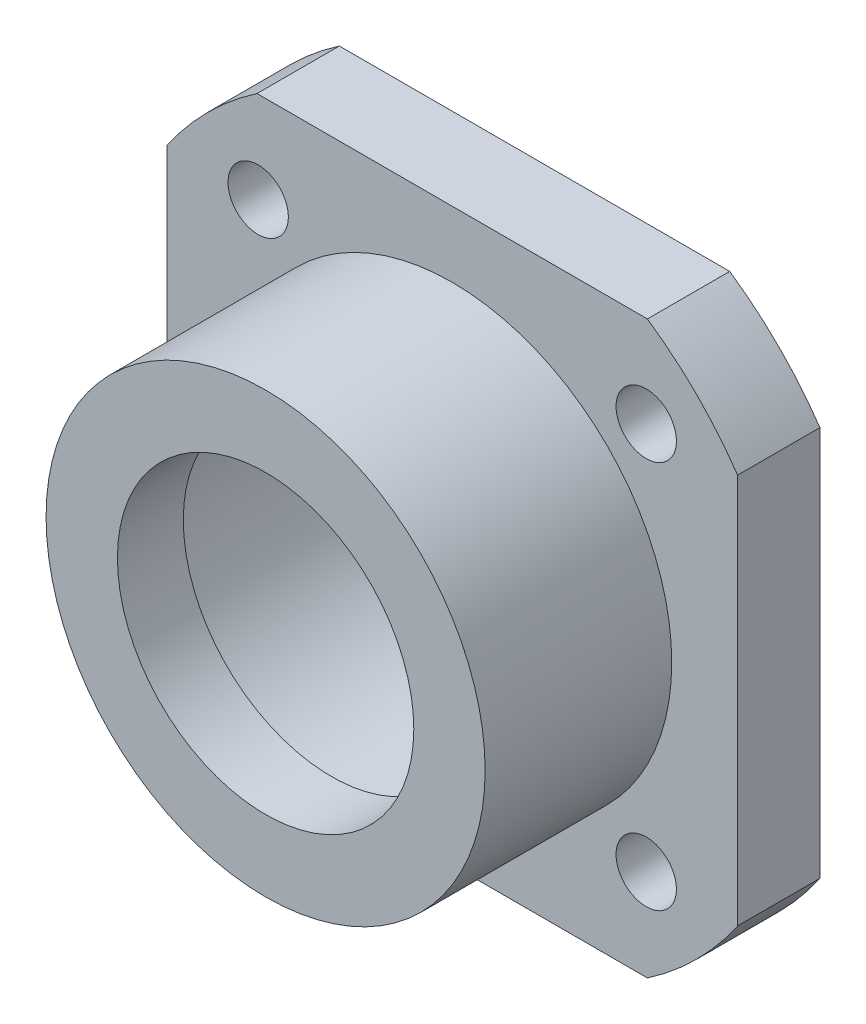
ISO-10303-21;
HEADER;
FILE_DESCRIPTION(('STEP AP214'),'2;1');
FILE_NAME('part.step','',(''),(''),'','','');
FILE_SCHEMA(('AUTOMOTIVE_DESIGN { 1 0 10303 214 1 1 1 1 }'));
ENDSEC;
DATA;
#1=APPLICATION_CONTEXT('core data for automotive mechanical design processes');
#2=APPLICATION_PROTOCOL_DEFINITION('international standard','automotive_design',2000,#1);
#3=PRODUCT_CONTEXT('',#1,'mechanical');
#4=PRODUCT('Part','Part','',(#3));
#5=PRODUCT_RELATED_PRODUCT_CATEGORY('part','',(#4));
#6=PRODUCT_DEFINITION_FORMATION('','',#4);
#7=PRODUCT_DEFINITION_CONTEXT('part definition',#1,'design');
#8=PRODUCT_DEFINITION('design','',#6,#7);
#9=PRODUCT_DEFINITION_SHAPE('','',#8);
#10=(LENGTH_UNIT() NAMED_UNIT(*) SI_UNIT(.MILLI.,.METRE.));
#11=(NAMED_UNIT(*) PLANE_ANGLE_UNIT() SI_UNIT($,.RADIAN.));
#12=(NAMED_UNIT(*) SI_UNIT($,.STERADIAN.) SOLID_ANGLE_UNIT());
#13=UNCERTAINTY_MEASURE_WITH_UNIT(LENGTH_MEASURE(1.E-05),#10,'distance_accuracy_value','');
#14=(GEOMETRIC_REPRESENTATION_CONTEXT(3) GLOBAL_UNCERTAINTY_ASSIGNED_CONTEXT((#13)) GLOBAL_UNIT_ASSIGNED_CONTEXT((#10,
#11,#12)) REPRESENTATION_CONTEXT('',''));
#15=CARTESIAN_POINT('',(0.,0.,0.));
#16=DIRECTION('',(0.,0.,1.));
#17=DIRECTION('',(1.,0.,0.));
#18=AXIS2_PLACEMENT_3D('',#15,#16,#17);
#19=CARTESIAN_POINT('',(0.,0.,32.));
#20=DIRECTION('',(0.,0.,1.));
#21=DIRECTION('',(-1.,0.,0.));
#22=AXIS2_PLACEMENT_3D('',#19,#20,#21);
#23=CYLINDRICAL_SURFACE('',#22,31.5);
#24=CARTESIAN_POINT('',(0.,0.,15.));
#25=DIRECTION('',(0.,0.,1.));
#26=DIRECTION('',(1.,0.,0.));
#27=AXIS2_PLACEMENT_3D('',#24,#25,#26);
#28=CIRCLE('',#27,31.5);
#29=CARTESIAN_POINT('',(17.7834192437787,-26.,15.));
#30=VERTEX_POINT('',#29);
#31=CARTESIAN_POINT('',(26.,-17.7834192437788,15.));
#32=VERTEX_POINT('',#31);
#33=EDGE_CURVE('E396',#30,#32,#28,.T.);
#34=ORIENTED_EDGE('',*,*,#33,.F.);
#35=DIRECTION('',(0.,0.,1.));
#36=VECTOR('',#35,1.);
#37=CARTESIAN_POINT('',(17.7834192437787,-26.,32.));
#38=LINE('',#37,#36);
#39=CARTESIAN_POINT('',(17.7834192437787,-26.,7.5));
#40=VERTEX_POINT('',#39);
#41=EDGE_CURVE('E335',#40,#30,#38,.T.);
#42=ORIENTED_EDGE('',*,*,#41,.F.);
#43=CARTESIAN_POINT('',(0.,0.,7.5));
#44=DIRECTION('',(0.,0.,-1.));
#45=DIRECTION('',(1.,0.,0.));
#46=AXIS2_PLACEMENT_3D('',#43,#44,#45);
#47=CIRCLE('',#46,31.5);
#48=CARTESIAN_POINT('',(26.,-17.7834192437788,7.5));
#49=VERTEX_POINT('',#48);
#50=EDGE_CURVE('E739',#49,#40,#47,.T.);
#51=ORIENTED_EDGE('',*,*,#50,.F.);
#52=DIRECTION('',(0.,0.,-1.));
#53=VECTOR('',#52,1.);
#54=CARTESIAN_POINT('',(26.,-17.7834192437788,32.));
#55=LINE('',#54,#53);
#56=EDGE_CURVE('E382',#32,#49,#55,.T.);
#57=ORIENTED_EDGE('',*,*,#56,.F.);
#58=EDGE_LOOP('',(#34,#42,#51,#57));
#59=FACE_BOUND('',#58,.T.);
#60=ADVANCED_FACE('F17',(#59),#23,.T.);
#61=CARTESIAN_POINT('',(19.,8.,7.879));
#62=DIRECTION('',(0.,0.,-1.));
#63=DIRECTION('',(-1.,0.,0.));
#64=AXIS2_PLACEMENT_3D('',#61,#62,#63);
#65=CONICAL_SURFACE('',#64,1.621,0.7853981634);
#66=CARTESIAN_POINT('',(19.,8.,7.879));
#67=DIRECTION('',(0.,0.,-1.));
#68=DIRECTION('',(-1.,0.,0.));
#69=AXIS2_PLACEMENT_3D('',#66,#67,#68);
#70=CIRCLE('',#69,1.621);
#71=CARTESIAN_POINT('',(20.621,8.,7.879));
#72=VERTEX_POINT('',#71);
#73=EDGE_CURVE('E411',#72,#72,#70,.T.);
#74=ORIENTED_EDGE('',*,*,#73,.F.);
#75=DIRECTION('',(0.707106781188352,0.,-0.707106781184743));
#76=VECTOR('',#75,1.);
#77=CARTESIAN_POINT('',(20.621,8.,7.879));
#78=LINE('',#77,#76);
#79=CARTESIAN_POINT('',(21.000000000001,8.,7.50000000000097));
#80=VERTEX_POINT('',#79);
#81=EDGE_CURVE('E11',#72,#80,#78,.T.);
#82=ORIENTED_EDGE('',*,*,#81,.T.);
#83=CARTESIAN_POINT('',(19.,8.,7.5));
#84=DIRECTION('',(0.,0.,-1.));
#85=DIRECTION('',(-1.,0.,0.));
#86=AXIS2_PLACEMENT_3D('',#83,#84,#85);
#87=CIRCLE('',#86,2.);
#88=EDGE_CURVE('E724',#80,#80,#87,.T.);
#89=ORIENTED_EDGE('',*,*,#88,.T.);
#90=ORIENTED_EDGE('',*,*,#81,.F.);
#91=EDGE_LOOP('',(#74,#82,#89,#90));
#92=FACE_BOUND('',#91,.T.);
#93=ADVANCED_FACE('F813',(#92),#65,.F.);
#94=CARTESIAN_POINT('',(19.,8.,7.5));
#95=DIRECTION('',(0.,0.,1.));
#96=DIRECTION('',(-1.,0.,0.));
#97=AXIS2_PLACEMENT_3D('',#94,#95,#96);
#98=CYLINDRICAL_SURFACE('',#97,1.621);
#99=ORIENTED_EDGE('',*,*,#73,.T.);
#100=DIRECTION('',(0.,0.,1.));
#101=VECTOR('',#100,1.);
#102=CARTESIAN_POINT('',(20.621,8.,7.5));
#103=LINE('',#102,#101);
#104=CARTESIAN_POINT('',(20.621,8.,12.621));
#105=VERTEX_POINT('',#104);
#106=EDGE_CURVE('E25',#72,#105,#103,.T.);
#107=ORIENTED_EDGE('',*,*,#106,.T.);
#108=CARTESIAN_POINT('',(19.,8.,12.621));
#109=DIRECTION('',(0.,0.,-1.));
#110=DIRECTION('',(-1.,0.,0.));
#111=AXIS2_PLACEMENT_3D('',#108,#109,#110);
#112=CIRCLE('',#111,1.621);
#113=CARTESIAN_POINT('',(17.379,8.,12.621));
#114=VERTEX_POINT('',#113);
#115=EDGE_CURVE('E284',#114,#105,#112,.T.);
#116=ORIENTED_EDGE('',*,*,#115,.F.);
#117=CARTESIAN_POINT('',(19.,8.,12.621));
#118=DIRECTION('',(0.,0.,-1.));
#119=DIRECTION('',(-1.,0.,0.));
#120=AXIS2_PLACEMENT_3D('',#117,#118,#119);
#121=CIRCLE('',#120,1.621);
#122=EDGE_CURVE('E393',#105,#114,#121,.T.);
#123=ORIENTED_EDGE('',*,*,#122,.F.);
#124=ORIENTED_EDGE('',*,*,#106,.F.);
#125=EDGE_LOOP('',(#99,#107,#116,#123,#124));
#126=FACE_BOUND('',#125,.T.);
#127=ADVANCED_FACE('F818',(#126),#98,.F.);
#128=CARTESIAN_POINT('',(19.,8.,13.));
#129=DIRECTION('',(0.,0.,1.));
#130=DIRECTION('',(1.,0.,0.));
#131=AXIS2_PLACEMENT_3D('',#128,#129,#130);
#132=CONICAL_SURFACE('',#131,2.,0.7853981634);
#133=ORIENTED_EDGE('',*,*,#115,.T.);
#134=ORIENTED_EDGE('',*,*,#122,.T.);
#135=DIRECTION('',(-0.707106781188352,0.,0.707106781184743));
#136=VECTOR('',#135,1.);
#137=CARTESIAN_POINT('',(17.,8.,13.));
#138=LINE('',#137,#136);
#139=CARTESIAN_POINT('',(17.,8.,13.));
#140=VERTEX_POINT('',#139);
#141=EDGE_CURVE('E164',#114,#140,#138,.T.);
#142=ORIENTED_EDGE('',*,*,#141,.T.);
#143=CARTESIAN_POINT('',(19.,8.,13.));
#144=DIRECTION('',(0.,0.,-1.));
#145=DIRECTION('',(-1.,0.,0.));
#146=AXIS2_PLACEMENT_3D('',#143,#144,#145);
#147=CIRCLE('',#146,2.);
#148=EDGE_CURVE('E278',#140,#140,#147,.T.);
#149=ORIENTED_EDGE('',*,*,#148,.F.);
#150=ORIENTED_EDGE('',*,*,#141,.F.);
#151=EDGE_LOOP('',(#133,#134,#142,#149,#150));
#152=FACE_BOUND('',#151,.T.);
#153=ADVANCED_FACE('F822',(#152),#132,.F.);
#154=CARTESIAN_POINT('',(19.,8.,13.));
#155=DIRECTION('',(0.,0.,-1.));
#156=DIRECTION('',(0.,-1.,0.));
#157=AXIS2_PLACEMENT_3D('',#154,#155,#156);
#158=PLANE('',#157);
#159=ORIENTED_EDGE('',*,*,#148,.T.);
#160=EDGE_LOOP('',(#159));
#161=FACE_BOUND('',#160,.T.);
#162=ADVANCED_FACE('F829',(#161),#158,.T.);
#163=CARTESIAN_POINT('',(8.,-19.,7.879));
#164=DIRECTION('',(0.,0.,-1.));
#165=DIRECTION('',(-1.,0.,0.));
#166=AXIS2_PLACEMENT_3D('',#163,#164,#165);
#167=CONICAL_SURFACE('',#166,1.621,0.7853981634);
#168=CARTESIAN_POINT('',(8.,-19.,7.879));
#169=DIRECTION('',(0.,0.,-1.));
#170=DIRECTION('',(-1.,0.,0.));
#171=AXIS2_PLACEMENT_3D('',#168,#169,#170);
#172=CIRCLE('',#171,1.621);
#173=CARTESIAN_POINT('',(9.621,-19.,7.879));
#174=VERTEX_POINT('',#173);
#175=EDGE_CURVE('E324',#174,#174,#172,.T.);
#176=ORIENTED_EDGE('',*,*,#175,.F.);
#177=DIRECTION('',(0.707106781188352,0.,-0.707106781184743));
#178=VECTOR('',#177,1.);
#179=CARTESIAN_POINT('',(9.621,-19.,7.879));
#180=LINE('',#179,#178);
#181=CARTESIAN_POINT('',(10.000000000001,-19.,7.50000000000097));
#182=VERTEX_POINT('',#181);
#183=EDGE_CURVE('E180',#174,#182,#180,.T.);
#184=ORIENTED_EDGE('',*,*,#183,.T.);
#185=CARTESIAN_POINT('',(8.,-19.,7.5));
#186=DIRECTION('',(0.,0.,-1.));
#187=DIRECTION('',(-1.,0.,0.));
#188=AXIS2_PLACEMENT_3D('',#185,#186,#187);
#189=CIRCLE('',#188,2.);
#190=EDGE_CURVE('E706',#182,#182,#189,.T.);
#191=ORIENTED_EDGE('',*,*,#190,.T.);
#192=ORIENTED_EDGE('',*,*,#183,.F.);
#193=EDGE_LOOP('',(#176,#184,#191,#192));
#194=FACE_BOUND('',#193,.T.);
#195=ADVANCED_FACE('F831',(#194),#167,.F.);
#196=CARTESIAN_POINT('',(8.,-19.,7.5));
#197=DIRECTION('',(0.,0.,1.));
#198=DIRECTION('',(-1.,0.,0.));
#199=AXIS2_PLACEMENT_3D('',#196,#197,#198);
#200=CYLINDRICAL_SURFACE('',#199,1.621);
#201=ORIENTED_EDGE('',*,*,#175,.T.);
#202=DIRECTION('',(0.,0.,1.));
#203=VECTOR('',#202,1.);
#204=CARTESIAN_POINT('',(9.621,-19.,7.5));
#205=LINE('',#204,#203);
#206=CARTESIAN_POINT('',(9.621,-19.,12.621));
#207=VERTEX_POINT('',#206);
#208=EDGE_CURVE('E316',#174,#207,#205,.T.);
#209=ORIENTED_EDGE('',*,*,#208,.T.);
#210=CARTESIAN_POINT('',(8.,-19.,12.621));
#211=DIRECTION('',(0.,0.,-1.));
#212=DIRECTION('',(-1.,0.,0.));
#213=AXIS2_PLACEMENT_3D('',#210,#211,#212);
#214=CIRCLE('',#213,1.621);
#215=CARTESIAN_POINT('',(6.379,-19.,12.621));
#216=VERTEX_POINT('',#215);
#217=EDGE_CURVE('E431',#216,#207,#214,.T.);
#218=ORIENTED_EDGE('',*,*,#217,.F.);
#219=CARTESIAN_POINT('',(8.,-19.,12.621));
#220=DIRECTION('',(0.,0.,-1.));
#221=DIRECTION('',(-1.,0.,0.));
#222=AXIS2_PLACEMENT_3D('',#219,#220,#221);
#223=CIRCLE('',#222,1.621);
#224=EDGE_CURVE('E434',#207,#216,#223,.T.);
#225=ORIENTED_EDGE('',*,*,#224,.F.);
#226=ORIENTED_EDGE('',*,*,#208,.F.);
#227=EDGE_LOOP('',(#201,#209,#218,#225,#226));
#228=FACE_BOUND('',#227,.T.);
#229=ADVANCED_FACE('F834',(#228),#200,.F.);
#230=CARTESIAN_POINT('',(8.,-19.,13.));
#231=DIRECTION('',(0.,0.,1.));
#232=DIRECTION('',(1.,0.,0.));
#233=AXIS2_PLACEMENT_3D('',#230,#231,#232);
#234=CONICAL_SURFACE('',#233,2.,0.7853981634);
#235=ORIENTED_EDGE('',*,*,#217,.T.);
#236=ORIENTED_EDGE('',*,*,#224,.T.);
#237=DIRECTION('',(-0.707106781188352,0.,0.707106781184743));
#238=VECTOR('',#237,1.);
#239=CARTESIAN_POINT('',(6.,-19.,13.));
#240=LINE('',#239,#238);
#241=CARTESIAN_POINT('',(6.,-19.,13.));
#242=VERTEX_POINT('',#241);
#243=EDGE_CURVE('E328',#216,#242,#240,.T.);
#244=ORIENTED_EDGE('',*,*,#243,.T.);
#245=CARTESIAN_POINT('',(8.,-19.,13.));
#246=DIRECTION('',(0.,0.,-1.));
#247=DIRECTION('',(-1.,0.,0.));
#248=AXIS2_PLACEMENT_3D('',#245,#246,#247);
#249=CIRCLE('',#248,2.);
#250=EDGE_CURVE('E436',#242,#242,#249,.T.);
#251=ORIENTED_EDGE('',*,*,#250,.F.);
#252=ORIENTED_EDGE('',*,*,#243,.F.);
#253=EDGE_LOOP('',(#235,#236,#244,#251,#252));
#254=FACE_BOUND('',#253,.T.);
#255=ADVANCED_FACE('F837',(#254),#234,.F.);
#256=CARTESIAN_POINT('',(8.,-19.,13.));
#257=DIRECTION('',(0.,0.,-1.));
#258=DIRECTION('',(0.,-1.,0.));
#259=AXIS2_PLACEMENT_3D('',#256,#257,#258);
#260=PLANE('',#259);
#261=ORIENTED_EDGE('',*,*,#250,.T.);
#262=EDGE_LOOP('',(#261));
#263=FACE_BOUND('',#262,.T.);
#264=ADVANCED_FACE('F838',(#263),#260,.T.);
#265=CARTESIAN_POINT('',(-19.,-8.,7.879));
#266=DIRECTION('',(0.,0.,-1.));
#267=DIRECTION('',(-1.,0.,0.));
#268=AXIS2_PLACEMENT_3D('',#265,#266,#267);
#269=CONICAL_SURFACE('',#268,1.621,0.7853981634);
#270=CARTESIAN_POINT('',(-19.,-8.,7.879));
#271=DIRECTION('',(0.,0.,-1.));
#272=DIRECTION('',(-1.,0.,0.));
#273=AXIS2_PLACEMENT_3D('',#270,#271,#272);
#274=CIRCLE('',#273,1.621);
#275=CARTESIAN_POINT('',(-17.379,-8.,7.879));
#276=VERTEX_POINT('',#275);
#277=EDGE_CURVE('E341',#276,#276,#274,.T.);
#278=ORIENTED_EDGE('',*,*,#277,.F.);
#279=DIRECTION('',(0.707106781188352,0.,-0.707106781184743));
#280=VECTOR('',#279,1.);
#281=CARTESIAN_POINT('',(-17.379,-8.,7.879));
#282=LINE('',#281,#280);
#283=CARTESIAN_POINT('',(-16.999999999999,-8.,7.50000000000097));
#284=VERTEX_POINT('',#283);
#285=EDGE_CURVE('E469',#276,#284,#282,.T.);
#286=ORIENTED_EDGE('',*,*,#285,.T.);
#287=CARTESIAN_POINT('',(-19.,-8.,7.5));
#288=DIRECTION('',(0.,0.,-1.));
#289=DIRECTION('',(-1.,0.,0.));
#290=AXIS2_PLACEMENT_3D('',#287,#288,#289);
#291=CIRCLE('',#290,2.);
#292=EDGE_CURVE('E277',#284,#284,#291,.T.);
#293=ORIENTED_EDGE('',*,*,#292,.T.);
#294=ORIENTED_EDGE('',*,*,#285,.F.);
#295=EDGE_LOOP('',(#278,#286,#293,#294));
#296=FACE_BOUND('',#295,.T.);
#297=ADVANCED_FACE('F842',(#296),#269,.F.);
#298=CARTESIAN_POINT('',(-19.,-8.,7.5));
#299=DIRECTION('',(0.,0.,1.));
#300=DIRECTION('',(-1.,0.,0.));
#301=AXIS2_PLACEMENT_3D('',#298,#299,#300);
#302=CYLINDRICAL_SURFACE('',#301,1.621);
#303=ORIENTED_EDGE('',*,*,#277,.T.);
#304=DIRECTION('',(0.,0.,1.));
#305=VECTOR('',#304,1.);
#306=CARTESIAN_POINT('',(-17.379,-8.,7.5));
#307=LINE('',#306,#305);
#308=CARTESIAN_POINT('',(-17.379,-8.,12.621));
#309=VERTEX_POINT('',#308);
#310=EDGE_CURVE('E348',#276,#309,#307,.T.);
#311=ORIENTED_EDGE('',*,*,#310,.T.);
#312=CARTESIAN_POINT('',(-19.,-8.,12.621));
#313=DIRECTION('',(0.,0.,-1.));
#314=DIRECTION('',(-1.,0.,0.));
#315=AXIS2_PLACEMENT_3D('',#312,#313,#314);
#316=CIRCLE('',#315,1.621);
#317=CARTESIAN_POINT('',(-20.621,-8.,12.621));
#318=VERTEX_POINT('',#317);
#319=EDGE_CURVE('E458',#318,#309,#316,.T.);
#320=ORIENTED_EDGE('',*,*,#319,.F.);
#321=CARTESIAN_POINT('',(-19.,-8.,12.621));
#322=DIRECTION('',(0.,0.,-1.));
#323=DIRECTION('',(-1.,0.,0.));
#324=AXIS2_PLACEMENT_3D('',#321,#322,#323);
#325=CIRCLE('',#324,1.621);
#326=EDGE_CURVE('E465',#309,#318,#325,.T.);
#327=ORIENTED_EDGE('',*,*,#326,.F.);
#328=ORIENTED_EDGE('',*,*,#310,.F.);
#329=EDGE_LOOP('',(#303,#311,#320,#327,#328));
#330=FACE_BOUND('',#329,.T.);
#331=ADVANCED_FACE('F847',(#330),#302,.F.);
#332=CARTESIAN_POINT('',(-19.,-8.,13.));
#333=DIRECTION('',(0.,0.,1.));
#334=DIRECTION('',(1.,0.,0.));
#335=AXIS2_PLACEMENT_3D('',#332,#333,#334);
#336=CONICAL_SURFACE('',#335,2.,0.7853981634);
#337=ORIENTED_EDGE('',*,*,#319,.T.);
#338=ORIENTED_EDGE('',*,*,#326,.T.);
#339=DIRECTION('',(-0.707106781188352,0.,0.707106781184743));
#340=VECTOR('',#339,1.);
#341=CARTESIAN_POINT('',(-21.,-8.,13.));
#342=LINE('',#341,#340);
#343=CARTESIAN_POINT('',(-21.,-8.,13.));
#344=VERTEX_POINT('',#343);
#345=EDGE_CURVE('E347',#318,#344,#342,.T.);
#346=ORIENTED_EDGE('',*,*,#345,.T.);
#347=CARTESIAN_POINT('',(-19.,-8.,13.));
#348=DIRECTION('',(0.,0.,-1.));
#349=DIRECTION('',(-1.,0.,0.));
#350=AXIS2_PLACEMENT_3D('',#347,#348,#349);
#351=CIRCLE('',#350,2.);
#352=EDGE_CURVE('E451',#344,#344,#351,.T.);
#353=ORIENTED_EDGE('',*,*,#352,.F.);
#354=ORIENTED_EDGE('',*,*,#345,.F.);
#355=EDGE_LOOP('',(#337,#338,#346,#353,#354));
#356=FACE_BOUND('',#355,.T.);
#357=ADVANCED_FACE('F855',(#356),#336,.F.);
#358=CARTESIAN_POINT('',(-19.,-8.,13.));
#359=DIRECTION('',(0.,0.,-1.));
#360=DIRECTION('',(0.,-1.,0.));
#361=AXIS2_PLACEMENT_3D('',#358,#359,#360);
#362=PLANE('',#361);
#363=ORIENTED_EDGE('',*,*,#352,.T.);
#364=EDGE_LOOP('',(#363));
#365=FACE_BOUND('',#364,.T.);
#366=ADVANCED_FACE('F858',(#365),#362,.T.);
#367=CARTESIAN_POINT('',(-8.,19.,7.879));
#368=DIRECTION('',(0.,0.,-1.));
#369=DIRECTION('',(-1.,0.,0.));
#370=AXIS2_PLACEMENT_3D('',#367,#368,#369);
#371=CONICAL_SURFACE('',#370,1.621,0.7853981634);
#372=CARTESIAN_POINT('',(-8.,19.,7.879));
#373=DIRECTION('',(0.,0.,-1.));
#374=DIRECTION('',(-1.,0.,0.));
#375=AXIS2_PLACEMENT_3D('',#372,#373,#374);
#376=CIRCLE('',#375,1.621);
#377=CARTESIAN_POINT('',(-6.379,19.,7.879));
#378=VERTEX_POINT('',#377);
#379=EDGE_CURVE('E375',#378,#378,#376,.T.);
#380=ORIENTED_EDGE('',*,*,#379,.F.);
#381=DIRECTION('',(0.707106781188352,0.,-0.707106781184743));
#382=VECTOR('',#381,1.);
#383=CARTESIAN_POINT('',(-6.379,19.,7.879));
#384=LINE('',#383,#382);
#385=CARTESIAN_POINT('',(-5.99999999999903,19.,7.50000000000097));
#386=VERTEX_POINT('',#385);
#387=EDGE_CURVE('E452',#378,#386,#384,.T.);
#388=ORIENTED_EDGE('',*,*,#387,.T.);
#389=CARTESIAN_POINT('',(-8.,19.,7.5));
#390=DIRECTION('',(0.,0.,-1.));
#391=DIRECTION('',(-1.,0.,0.));
#392=AXIS2_PLACEMENT_3D('',#389,#390,#391);
#393=CIRCLE('',#392,2.);
#394=EDGE_CURVE('E264',#386,#386,#393,.T.);
#395=ORIENTED_EDGE('',*,*,#394,.T.);
#396=ORIENTED_EDGE('',*,*,#387,.F.);
#397=EDGE_LOOP('',(#380,#388,#395,#396));
#398=FACE_BOUND('',#397,.T.);
#399=ADVANCED_FACE('F859',(#398),#371,.F.);
#400=CARTESIAN_POINT('',(-8.,19.,7.5));
#401=DIRECTION('',(0.,0.,1.));
#402=DIRECTION('',(-1.,0.,0.));
#403=AXIS2_PLACEMENT_3D('',#400,#401,#402);
#404=CYLINDRICAL_SURFACE('',#403,1.621);
#405=ORIENTED_EDGE('',*,*,#379,.T.);
#406=DIRECTION('',(0.,0.,1.));
#407=VECTOR('',#406,1.);
#408=CARTESIAN_POINT('',(-6.379,19.,7.5));
#409=LINE('',#408,#407);
#410=CARTESIAN_POINT('',(-6.379,19.,12.621));
#411=VERTEX_POINT('',#410);
#412=EDGE_CURVE('E376',#378,#411,#409,.T.);
#413=ORIENTED_EDGE('',*,*,#412,.T.);
#414=CARTESIAN_POINT('',(-8.,19.,12.621));
#415=DIRECTION('',(0.,0.,-1.));
#416=DIRECTION('',(-1.,0.,0.));
#417=AXIS2_PLACEMENT_3D('',#414,#415,#416);
#418=CIRCLE('',#417,1.621);
#419=CARTESIAN_POINT('',(-9.621,19.,12.621));
#420=VERTEX_POINT('',#419);
#421=EDGE_CURVE('E429',#420,#411,#418,.T.);
#422=ORIENTED_EDGE('',*,*,#421,.F.);
#423=CARTESIAN_POINT('',(-8.,19.,12.621));
#424=DIRECTION('',(0.,0.,-1.));
#425=DIRECTION('',(-1.,0.,0.));
#426=AXIS2_PLACEMENT_3D('',#423,#424,#425);
#427=CIRCLE('',#426,1.621);
#428=EDGE_CURVE('E439',#411,#420,#427,.T.);
#429=ORIENTED_EDGE('',*,*,#428,.F.);
#430=ORIENTED_EDGE('',*,*,#412,.F.);
#431=EDGE_LOOP('',(#405,#413,#422,#429,#430));
#432=FACE_BOUND('',#431,.T.);
#433=ADVANCED_FACE('F864',(#432),#404,.F.);
#434=CARTESIAN_POINT('',(-8.,19.,13.));
#435=DIRECTION('',(0.,0.,1.));
#436=DIRECTION('',(1.,0.,0.));
#437=AXIS2_PLACEMENT_3D('',#434,#435,#436);
#438=CONICAL_SURFACE('',#437,2.,0.7853981634);
#439=ORIENTED_EDGE('',*,*,#421,.T.);
#440=ORIENTED_EDGE('',*,*,#428,.T.);
#441=DIRECTION('',(-0.707106781188352,0.,0.707106781184743));
#442=VECTOR('',#441,1.);
#443=CARTESIAN_POINT('',(-10.,19.,13.));
#444=LINE('',#443,#442);
#445=CARTESIAN_POINT('',(-10.,19.,13.));
#446=VERTEX_POINT('',#445);
#447=EDGE_CURVE('E380',#420,#446,#444,.T.);
#448=ORIENTED_EDGE('',*,*,#447,.T.);
#449=CARTESIAN_POINT('',(-8.,19.,13.));
#450=DIRECTION('',(0.,0.,-1.));
#451=DIRECTION('',(-1.,0.,0.));
#452=AXIS2_PLACEMENT_3D('',#449,#450,#451);
#453=CIRCLE('',#452,2.);
#454=EDGE_CURVE('E260',#446,#446,#453,.T.);
#455=ORIENTED_EDGE('',*,*,#454,.F.);
#456=ORIENTED_EDGE('',*,*,#447,.F.);
#457=EDGE_LOOP('',(#439,#440,#448,#455,#456));
#458=FACE_BOUND('',#457,.T.);
#459=ADVANCED_FACE('F868',(#458),#438,.F.);
#460=CARTESIAN_POINT('',(-8.,19.,13.));
#461=DIRECTION('',(0.,0.,-1.));
#462=DIRECTION('',(0.,-1.,0.));
#463=AXIS2_PLACEMENT_3D('',#460,#461,#462);
#464=PLANE('',#463);
#465=ORIENTED_EDGE('',*,*,#454,.T.);
#466=EDGE_LOOP('',(#465));
#467=FACE_BOUND('',#466,.T.);
#468=ADVANCED_FACE('F875',(#467),#464,.T.);
#469=CARTESIAN_POINT('',(-17.6776695296637,17.6776695296637,15.));
#470=DIRECTION('',(0.,0.,1.));
#471=DIRECTION('',(-1.,0.,0.));
#472=AXIS2_PLACEMENT_3D('',#469,#470,#471);
#473=CYLINDRICAL_SURFACE('',#472,2.75);
#474=CARTESIAN_POINT('',(-17.6776695296637,17.6776695296637,7.5));
#475=DIRECTION('',(0.,0.,1.));
#476=DIRECTION('',(1.,0.,0.));
#477=AXIS2_PLACEMENT_3D('',#474,#475,#476);
#478=CIRCLE('',#477,2.75);
#479=CARTESIAN_POINT('',(-14.9276695296637,17.6776695296637,7.5));
#480=VERTEX_POINT('',#479);
#481=EDGE_CURVE('E251',#480,#480,#478,.T.);
#482=ORIENTED_EDGE('',*,*,#481,.F.);
#483=DIRECTION('',(0.,0.,1.));
#484=VECTOR('',#483,1.);
#485=CARTESIAN_POINT('',(-14.9276695296637,17.6776695296637,15.));
#486=LINE('',#485,#484);
#487=CARTESIAN_POINT('',(-14.9276695296637,17.6776695296637,15.));
#488=VERTEX_POINT('',#487);
#489=EDGE_CURVE('E249',#480,#488,#486,.T.);
#490=ORIENTED_EDGE('',*,*,#489,.T.);
#491=CARTESIAN_POINT('',(-17.6776695296637,17.6776695296637,15.));
#492=DIRECTION('',(0.,0.,1.));
#493=DIRECTION('',(1.,0.,0.));
#494=AXIS2_PLACEMENT_3D('',#491,#492,#493);
#495=CIRCLE('',#494,2.75);
#496=EDGE_CURVE('E254',#488,#488,#495,.T.);
#497=ORIENTED_EDGE('',*,*,#496,.T.);
#498=ORIENTED_EDGE('',*,*,#489,.F.);
#499=EDGE_LOOP('',(#482,#490,#497,#498));
#500=FACE_BOUND('',#499,.T.);
#501=ADVANCED_FACE('F252',(#500),#473,.F.);
#502=CARTESIAN_POINT('',(-17.6776695296637,-17.6776695296637,15.));
#503=DIRECTION('',(0.,0.,1.));
#504=DIRECTION('',(-1.,0.,0.));
#505=AXIS2_PLACEMENT_3D('',#502,#503,#504);
#506=CYLINDRICAL_SURFACE('',#505,2.75);
#507=CARTESIAN_POINT('',(-17.6776695296637,-17.6776695296637,7.5));
#508=DIRECTION('',(0.,0.,1.));
#509=DIRECTION('',(1.,0.,0.));
#510=AXIS2_PLACEMENT_3D('',#507,#508,#509);
#511=CIRCLE('',#510,2.75);
#512=CARTESIAN_POINT('',(-14.9276695296637,-17.6776695296637,7.5));
#513=VERTEX_POINT('',#512);
#514=EDGE_CURVE('E262',#513,#513,#511,.T.);
#515=ORIENTED_EDGE('',*,*,#514,.F.);
#516=DIRECTION('',(0.,0.,1.));
#517=VECTOR('',#516,1.);
#518=CARTESIAN_POINT('',(-14.9276695296637,-17.6776695296637,15.));
#519=LINE('',#518,#517);
#520=CARTESIAN_POINT('',(-14.9276695296637,-17.6776695296637,15.));
#521=VERTEX_POINT('',#520);
#522=EDGE_CURVE('E256',#513,#521,#519,.T.);
#523=ORIENTED_EDGE('',*,*,#522,.T.);
#524=CARTESIAN_POINT('',(-17.6776695296637,-17.6776695296637,15.));
#525=DIRECTION('',(0.,0.,1.));
#526=DIRECTION('',(1.,0.,0.));
#527=AXIS2_PLACEMENT_3D('',#524,#525,#526);
#528=CIRCLE('',#527,2.75);
#529=EDGE_CURVE('E402',#521,#521,#528,.T.);
#530=ORIENTED_EDGE('',*,*,#529,.T.);
#531=ORIENTED_EDGE('',*,*,#522,.F.);
#532=EDGE_LOOP('',(#515,#523,#530,#531));
#533=FACE_BOUND('',#532,.T.);
#534=ADVANCED_FACE('F882',(#533),#506,.F.);
#535=CARTESIAN_POINT('',(17.6776695296637,-17.6776695296637,15.));
#536=DIRECTION('',(0.,0.,1.));
#537=DIRECTION('',(-1.,0.,0.));
#538=AXIS2_PLACEMENT_3D('',#535,#536,#537);
#539=CYLINDRICAL_SURFACE('',#538,2.75);
#540=CARTESIAN_POINT('',(17.6776695296637,-17.6776695296637,7.5));
#541=DIRECTION('',(0.,0.,1.));
#542=DIRECTION('',(1.,0.,0.));
#543=AXIS2_PLACEMENT_3D('',#540,#541,#542);
#544=CIRCLE('',#543,2.75);
#545=CARTESIAN_POINT('',(20.4276695296637,-17.6776695296637,7.5));
#546=VERTEX_POINT('',#545);
#547=EDGE_CURVE('E272',#546,#546,#544,.T.);
#548=ORIENTED_EDGE('',*,*,#547,.F.);
#549=DIRECTION('',(0.,0.,1.));
#550=VECTOR('',#549,1.);
#551=CARTESIAN_POINT('',(20.4276695296637,-17.6776695296637,15.));
#552=LINE('',#551,#550);
#553=CARTESIAN_POINT('',(20.4276695296637,-17.6776695296637,15.));
#554=VERTEX_POINT('',#553);
#555=EDGE_CURVE('E425',#546,#554,#552,.T.);
#556=ORIENTED_EDGE('',*,*,#555,.T.);
#557=CARTESIAN_POINT('',(17.6776695296637,-17.6776695296637,15.));
#558=DIRECTION('',(0.,0.,1.));
#559=DIRECTION('',(1.,0.,0.));
#560=AXIS2_PLACEMENT_3D('',#557,#558,#559);
#561=CIRCLE('',#560,2.75);
#562=EDGE_CURVE('E407',#554,#554,#561,.T.);
#563=ORIENTED_EDGE('',*,*,#562,.T.);
#564=ORIENTED_EDGE('',*,*,#555,.F.);
#565=EDGE_LOOP('',(#548,#556,#563,#564));
#566=FACE_BOUND('',#565,.T.);
#567=ADVANCED_FACE('F808',(#566),#539,.F.);
#568=CARTESIAN_POINT('',(17.6776695296637,17.6776695296637,15.));
#569=DIRECTION('',(0.,0.,1.));
#570=DIRECTION('',(-1.,0.,0.));
#571=AXIS2_PLACEMENT_3D('',#568,#569,#570);
#572=CYLINDRICAL_SURFACE('',#571,2.75);
#573=CARTESIAN_POINT('',(17.6776695296637,17.6776695296637,7.5));
#574=DIRECTION('',(0.,0.,1.));
#575=DIRECTION('',(1.,0.,0.));
#576=AXIS2_PLACEMENT_3D('',#573,#574,#575);
#577=CIRCLE('',#576,2.75);
#578=CARTESIAN_POINT('',(20.4276695296637,17.6776695296637,7.5));
#579=VERTEX_POINT('',#578);
#580=EDGE_CURVE('E287',#579,#579,#577,.T.);
#581=ORIENTED_EDGE('',*,*,#580,.F.);
#582=DIRECTION('',(0.,0.,1.));
#583=VECTOR('',#582,1.);
#584=CARTESIAN_POINT('',(20.4276695296637,17.6776695296637,15.));
#585=LINE('',#584,#583);
#586=CARTESIAN_POINT('',(20.4276695296637,17.6776695296637,15.));
#587=VERTEX_POINT('',#586);
#588=EDGE_CURVE('E420',#579,#587,#585,.T.);
#589=ORIENTED_EDGE('',*,*,#588,.T.);
#590=CARTESIAN_POINT('',(17.6776695296637,17.6776695296637,15.));
#591=DIRECTION('',(0.,0.,1.));
#592=DIRECTION('',(1.,0.,0.));
#593=AXIS2_PLACEMENT_3D('',#590,#591,#592);
#594=CIRCLE('',#593,2.75);
#595=EDGE_CURVE('E414',#587,#587,#594,.T.);
#596=ORIENTED_EDGE('',*,*,#595,.T.);
#597=ORIENTED_EDGE('',*,*,#588,.F.);
#598=EDGE_LOOP('',(#581,#589,#596,#597));
#599=FACE_BOUND('',#598,.T.);
#600=ADVANCED_FACE('F793',(#599),#572,.F.);
#601=CARTESIAN_POINT('',(0.,0.,15.));
#602=DIRECTION('',(0.,0.,1.));
#603=DIRECTION('',(1.,0.,0.));
#604=AXIS2_PLACEMENT_3D('',#601,#602,#603);
#605=PLANE('',#604);
#606=CARTESIAN_POINT('',(0.,0.,15.));
#607=DIRECTION('',(0.,0.,1.));
#608=DIRECTION('',(1.,0.,0.));
#609=AXIS2_PLACEMENT_3D('',#606,#607,#608);
#610=CIRCLE('',#609,20.);
#611=CARTESIAN_POINT('',(20.,0.,15.));
#612=VERTEX_POINT('',#611);
#613=EDGE_CURVE('E394',#612,#612,#610,.T.);
#614=ORIENTED_EDGE('',*,*,#613,.F.);
#615=EDGE_LOOP('',(#614));
#616=FACE_BOUND('',#615,.T.);
#617=ORIENTED_EDGE('',*,*,#595,.F.);
#618=EDGE_LOOP('',(#617));
#619=FACE_BOUND('',#618,.T.);
#620=ORIENTED_EDGE('',*,*,#562,.F.);
#621=EDGE_LOOP('',(#620));
#622=FACE_BOUND('',#621,.T.);
#623=ORIENTED_EDGE('',*,*,#529,.F.);
#624=EDGE_LOOP('',(#623));
#625=FACE_BOUND('',#624,.T.);
#626=ORIENTED_EDGE('',*,*,#496,.F.);
#627=EDGE_LOOP('',(#626));
#628=FACE_BOUND('',#627,.T.);
#629=CARTESIAN_POINT('',(0.,0.,15.));
#630=DIRECTION('',(0.,0.,1.));
#631=DIRECTION('',(1.,0.,0.));
#632=AXIS2_PLACEMENT_3D('',#629,#630,#631);
#633=CIRCLE('',#632,31.5);
#634=CARTESIAN_POINT('',(-17.7834192437787,26.,15.));
#635=VERTEX_POINT('',#634);
#636=CARTESIAN_POINT('',(-26.,17.7834192437787,15.));
#637=VERTEX_POINT('',#636);
#638=EDGE_CURVE('E336',#635,#637,#633,.T.);
#639=ORIENTED_EDGE('',*,*,#638,.T.);
#640=DIRECTION('',(0.,-1.,0.));
#641=VECTOR('',#640,1.);
#642=CARTESIAN_POINT('',(-26.,26.,15.));
#643=LINE('',#642,#641);
#644=CARTESIAN_POINT('',(-26.,-17.7834192437787,15.));
#645=VERTEX_POINT('',#644);
#646=EDGE_CURVE('E308',#637,#645,#643,.T.);
#647=ORIENTED_EDGE('',*,*,#646,.T.);
#648=CARTESIAN_POINT('',(0.,0.,15.));
#649=DIRECTION('',(0.,0.,1.));
#650=DIRECTION('',(1.,0.,0.));
#651=AXIS2_PLACEMENT_3D('',#648,#649,#650);
#652=CIRCLE('',#651,31.5);
#653=CARTESIAN_POINT('',(-17.7834192437787,-26.,15.));
#654=VERTEX_POINT('',#653);
#655=EDGE_CURVE('E344',#645,#654,#652,.T.);
#656=ORIENTED_EDGE('',*,*,#655,.T.);
#657=DIRECTION('',(1.,0.,0.));
#658=VECTOR('',#657,1.);
#659=CARTESIAN_POINT('',(-26.,-26.,15.));
#660=LINE('',#659,#658);
#661=EDGE_CURVE('E319',#654,#30,#660,.T.);
#662=ORIENTED_EDGE('',*,*,#661,.T.);
#663=ORIENTED_EDGE('',*,*,#33,.T.);
#664=DIRECTION('',(0.,1.,0.));
#665=VECTOR('',#664,1.);
#666=CARTESIAN_POINT('',(26.,-26.,15.));
#667=LINE('',#666,#665);
#668=CARTESIAN_POINT('',(26.,17.7834192437787,15.));
#669=VERTEX_POINT('',#668);
#670=EDGE_CURVE('E379',#32,#669,#667,.T.);
#671=ORIENTED_EDGE('',*,*,#670,.T.);
#672=CARTESIAN_POINT('',(0.,0.,15.));
#673=DIRECTION('',(0.,0.,1.));
#674=DIRECTION('',(1.,0.,0.));
#675=AXIS2_PLACEMENT_3D('',#672,#673,#674);
#676=CIRCLE('',#675,31.5);
#677=CARTESIAN_POINT('',(17.7834192437787,26.,15.));
#678=VERTEX_POINT('',#677);
#679=EDGE_CURVE('E355',#669,#678,#676,.T.);
#680=ORIENTED_EDGE('',*,*,#679,.T.);
#681=DIRECTION('',(-1.,0.,0.));
#682=VECTOR('',#681,1.);
#683=CARTESIAN_POINT('',(26.,26.,15.));
#684=LINE('',#683,#682);
#685=EDGE_CURVE('E371',#678,#635,#684,.T.);
#686=ORIENTED_EDGE('',*,*,#685,.T.);
#687=EDGE_LOOP('',(#639,#647,#656,#662,#663,#671,#680,#686));
#688=FACE_BOUND('',#687,.T.);
#689=ADVANCED_FACE('F791',(#616,#619,#622,#625,#628,#688),#605,.T.);
#690=CARTESIAN_POINT('',(0.,0.,32.));
#691=DIRECTION('',(0.,0.,1.));
#692=DIRECTION('',(-1.,0.,0.));
#693=AXIS2_PLACEMENT_3D('',#690,#691,#692);
#694=CYLINDRICAL_SURFACE('',#693,20.);
#695=CARTESIAN_POINT('',(0.,0.,32.));
#696=DIRECTION('',(0.,0.,1.));
#697=DIRECTION('',(1.,0.,0.));
#698=AXIS2_PLACEMENT_3D('',#695,#696,#697);
#699=CIRCLE('',#698,20.);
#700=CARTESIAN_POINT('',(20.,0.,32.));
#701=VERTEX_POINT('',#700);
#702=EDGE_CURVE('E361',#701,#701,#699,.T.);
#703=ORIENTED_EDGE('',*,*,#702,.F.);
#704=DIRECTION('',(0.,0.,-1.));
#705=VECTOR('',#704,1.);
#706=CARTESIAN_POINT('',(20.,0.,32.));
#707=LINE('',#706,#705);
#708=EDGE_CURVE('E386',#701,#612,#707,.T.);
#709=ORIENTED_EDGE('',*,*,#708,.T.);
#710=ORIENTED_EDGE('',*,*,#613,.T.);
#711=ORIENTED_EDGE('',*,*,#708,.F.);
#712=EDGE_LOOP('',(#703,#709,#710,#711));
#713=FACE_BOUND('',#712,.T.);
#714=ADVANCED_FACE('F792',(#713),#694,.T.);
#715=CARTESIAN_POINT('',(0.,0.,32.));
#716=DIRECTION('',(0.,0.,1.));
#717=DIRECTION('',(-1.,0.,0.));
#718=AXIS2_PLACEMENT_3D('',#715,#716,#717);
#719=CYLINDRICAL_SURFACE('',#718,13.5);
#720=CARTESIAN_POINT('',(0.,0.,26.));
#721=DIRECTION('',(0.,0.,1.));
#722=DIRECTION('',(1.,0.,0.));
#723=AXIS2_PLACEMENT_3D('',#720,#721,#722);
#724=CIRCLE('',#723,13.5);
#725=CARTESIAN_POINT('',(13.5,0.,26.));
#726=VERTEX_POINT('',#725);
#727=EDGE_CURVE('E305',#726,#726,#724,.T.);
#728=ORIENTED_EDGE('',*,*,#727,.F.);
#729=DIRECTION('',(0.,0.,1.));
#730=VECTOR('',#729,1.);
#731=CARTESIAN_POINT('',(13.5,0.,32.));
#732=LINE('',#731,#730);
#733=CARTESIAN_POINT('',(13.5,0.,32.));
#734=VERTEX_POINT('',#733);
#735=EDGE_CURVE('E387',#726,#734,#732,.T.);
#736=ORIENTED_EDGE('',*,*,#735,.T.);
#737=CARTESIAN_POINT('',(0.,0.,32.));
#738=DIRECTION('',(0.,0.,1.));
#739=DIRECTION('',(1.,0.,0.));
#740=AXIS2_PLACEMENT_3D('',#737,#738,#739);
#741=CIRCLE('',#740,13.5);
#742=EDGE_CURVE('E370',#734,#734,#741,.T.);
#743=ORIENTED_EDGE('',*,*,#742,.T.);
#744=ORIENTED_EDGE('',*,*,#735,.F.);
#745=EDGE_LOOP('',(#728,#736,#743,#744));
#746=FACE_BOUND('',#745,.T.);
#747=ADVANCED_FACE('F801',(#746),#719,.F.);
#748=CARTESIAN_POINT('',(26.,-26.,32.));
#749=DIRECTION('',(-1.,0.,0.));
#750=DIRECTION('',(0.,0.,1.));
#751=AXIS2_PLACEMENT_3D('',#748,#749,#750);
#752=PLANE('',#751);
#753=ORIENTED_EDGE('',*,*,#670,.F.);
#754=ORIENTED_EDGE('',*,*,#56,.T.);
#755=DIRECTION('',(0.,1.,0.));
#756=VECTOR('',#755,1.);
#757=CARTESIAN_POINT('',(26.,-26.,7.5));
#758=LINE('',#757,#756);
#759=CARTESIAN_POINT('',(26.,17.7834192437787,7.5));
#760=VERTEX_POINT('',#759);
#761=EDGE_CURVE('E736',#49,#760,#758,.T.);
#762=ORIENTED_EDGE('',*,*,#761,.T.);
#763=DIRECTION('',(0.,0.,1.));
#764=VECTOR('',#763,1.);
#765=CARTESIAN_POINT('',(26.,17.7834192437787,32.));
#766=LINE('',#765,#764);
#767=EDGE_CURVE('E356',#760,#669,#766,.T.);
#768=ORIENTED_EDGE('',*,*,#767,.T.);
#769=EDGE_LOOP('',(#753,#754,#762,#768));
#770=FACE_BOUND('',#769,.T.);
#771=ADVANCED_FACE('F781',(#770),#752,.F.);
#772=CARTESIAN_POINT('',(26.,26.,32.));
#773=DIRECTION('',(0.,-1.,0.));
#774=DIRECTION('',(0.,0.,-1.));
#775=AXIS2_PLACEMENT_3D('',#772,#773,#774);
#776=PLANE('',#775);
#777=ORIENTED_EDGE('',*,*,#685,.F.);
#778=DIRECTION('',(0.,0.,-1.));
#779=VECTOR('',#778,1.);
#780=CARTESIAN_POINT('',(17.7834192437787,26.,32.));
#781=LINE('',#780,#779);
#782=CARTESIAN_POINT('',(17.7834192437787,26.,7.5));
#783=VERTEX_POINT('',#782);
#784=EDGE_CURVE('E359',#678,#783,#781,.T.);
#785=ORIENTED_EDGE('',*,*,#784,.T.);
#786=DIRECTION('',(-1.,0.,0.));
#787=VECTOR('',#786,1.);
#788=CARTESIAN_POINT('',(26.,26.,7.5));
#789=LINE('',#788,#787);
#790=CARTESIAN_POINT('',(-17.7834192437787,26.,7.5));
#791=VERTEX_POINT('',#790);
#792=EDGE_CURVE('E696',#783,#791,#789,.T.);
#793=ORIENTED_EDGE('',*,*,#792,.T.);
#794=DIRECTION('',(0.,0.,1.));
#795=VECTOR('',#794,1.);
#796=CARTESIAN_POINT('',(-17.7834192437787,26.,32.));
#797=LINE('',#796,#795);
#798=EDGE_CURVE('E338',#791,#635,#797,.T.);
#799=ORIENTED_EDGE('',*,*,#798,.T.);
#800=EDGE_LOOP('',(#777,#785,#793,#799));
#801=FACE_BOUND('',#800,.T.);
#802=ADVANCED_FACE('F777',(#801),#776,.F.);
#803=CARTESIAN_POINT('',(0.,0.,32.));
#804=DIRECTION('',(0.,0.,1.));
#805=DIRECTION('',(1.,0.,0.));
#806=AXIS2_PLACEMENT_3D('',#803,#804,#805);
#807=PLANE('',#806);
#808=ORIENTED_EDGE('',*,*,#742,.F.);
#809=EDGE_LOOP('',(#808));
#810=FACE_BOUND('',#809,.T.);
#811=ORIENTED_EDGE('',*,*,#702,.T.);
#812=EDGE_LOOP('',(#811));
#813=FACE_BOUND('',#812,.T.);
#814=ADVANCED_FACE('F917',(#810,#813),#807,.T.);
#815=CARTESIAN_POINT('',(0.,0.,32.));
#816=DIRECTION('',(0.,0.,1.));
#817=DIRECTION('',(-1.,0.,0.));
#818=AXIS2_PLACEMENT_3D('',#815,#816,#817);
#819=CYLINDRICAL_SURFACE('',#818,31.5);
#820=ORIENTED_EDGE('',*,*,#679,.F.);
#821=ORIENTED_EDGE('',*,*,#767,.F.);
#822=CARTESIAN_POINT('',(0.,0.,7.5));
#823=DIRECTION('',(0.,0.,1.));
#824=DIRECTION('',(1.,0.,0.));
#825=AXIS2_PLACEMENT_3D('',#822,#823,#824);
#826=CIRCLE('',#825,31.5);
#827=EDGE_CURVE('E712',#760,#783,#826,.T.);
#828=ORIENTED_EDGE('',*,*,#827,.T.);
#829=ORIENTED_EDGE('',*,*,#784,.F.);
#830=EDGE_LOOP('',(#820,#821,#828,#829));
#831=FACE_BOUND('',#830,.T.);
#832=ADVANCED_FACE('F782',(#831),#819,.T.);
#833=CARTESIAN_POINT('',(0.,0.,32.));
#834=DIRECTION('',(0.,0.,1.));
#835=DIRECTION('',(-1.,0.,0.));
#836=AXIS2_PLACEMENT_3D('',#833,#834,#835);
#837=CYLINDRICAL_SURFACE('',#836,31.5);
#838=ORIENTED_EDGE('',*,*,#655,.F.);
#839=DIRECTION('',(0.,0.,1.));
#840=VECTOR('',#839,1.);
#841=CARTESIAN_POINT('',(-26.,-17.7834192437787,32.));
#842=LINE('',#841,#840);
#843=CARTESIAN_POINT('',(-26.,-17.7834192437787,7.5));
#844=VERTEX_POINT('',#843);
#845=EDGE_CURVE('E309',#844,#645,#842,.T.);
#846=ORIENTED_EDGE('',*,*,#845,.F.);
#847=CARTESIAN_POINT('',(0.,0.,7.5));
#848=DIRECTION('',(0.,0.,-1.));
#849=DIRECTION('',(1.,0.,0.));
#850=AXIS2_PLACEMENT_3D('',#847,#848,#849);
#851=CIRCLE('',#850,31.5);
#852=CARTESIAN_POINT('',(-17.7834192437787,-26.,7.5));
#853=VERTEX_POINT('',#852);
#854=EDGE_CURVE('E685',#853,#844,#851,.T.);
#855=ORIENTED_EDGE('',*,*,#854,.F.);
#856=DIRECTION('',(0.,0.,-1.));
#857=VECTOR('',#856,1.);
#858=CARTESIAN_POINT('',(-17.7834192437787,-26.,32.));
#859=LINE('',#858,#857);
#860=EDGE_CURVE('E322',#654,#853,#859,.T.);
#861=ORIENTED_EDGE('',*,*,#860,.F.);
#862=EDGE_LOOP('',(#838,#846,#855,#861));
#863=FACE_BOUND('',#862,.T.);
#864=ADVANCED_FACE('F762',(#863),#837,.T.);
#865=CARTESIAN_POINT('',(0.,0.,32.));
#866=DIRECTION('',(0.,0.,1.));
#867=DIRECTION('',(-1.,0.,0.));
#868=AXIS2_PLACEMENT_3D('',#865,#866,#867);
#869=CYLINDRICAL_SURFACE('',#868,31.5);
#870=ORIENTED_EDGE('',*,*,#638,.F.);
#871=ORIENTED_EDGE('',*,*,#798,.F.);
#872=CARTESIAN_POINT('',(0.,0.,7.5));
#873=DIRECTION('',(0.,0.,-1.));
#874=DIRECTION('',(1.,0.,0.));
#875=AXIS2_PLACEMENT_3D('',#872,#873,#874);
#876=CIRCLE('',#875,31.5);
#877=CARTESIAN_POINT('',(-26.,17.7834192437787,7.5));
#878=VERTEX_POINT('',#877);
#879=EDGE_CURVE('E693',#878,#791,#876,.T.);
#880=ORIENTED_EDGE('',*,*,#879,.F.);
#881=DIRECTION('',(0.,0.,-1.));
#882=VECTOR('',#881,1.);
#883=CARTESIAN_POINT('',(-26.,17.7834192437787,32.));
#884=LINE('',#883,#882);
#885=EDGE_CURVE('E307',#637,#878,#884,.T.);
#886=ORIENTED_EDGE('',*,*,#885,.F.);
#887=EDGE_LOOP('',(#870,#871,#880,#886));
#888=FACE_BOUND('',#887,.T.);
#889=ADVANCED_FACE('F774',(#888),#869,.T.);
#890=CARTESIAN_POINT('',(-26.,-26.,32.));
#891=DIRECTION('',(0.,1.,0.));
#892=DIRECTION('',(1.,0.,0.));
#893=AXIS2_PLACEMENT_3D('',#890,#891,#892);
#894=PLANE('',#893);
#895=ORIENTED_EDGE('',*,*,#661,.F.);
#896=ORIENTED_EDGE('',*,*,#860,.T.);
#897=DIRECTION('',(1.,0.,0.));
#898=VECTOR('',#897,1.);
#899=CARTESIAN_POINT('',(-26.,-26.,7.5));
#900=LINE('',#899,#898);
#901=EDGE_CURVE('E748',#853,#40,#900,.T.);
#902=ORIENTED_EDGE('',*,*,#901,.T.);
#903=ORIENTED_EDGE('',*,*,#41,.T.);
#904=EDGE_LOOP('',(#895,#896,#902,#903));
#905=FACE_BOUND('',#904,.T.);
#906=ADVANCED_FACE('F787',(#905),#894,.F.);
#907=CARTESIAN_POINT('',(-26.,26.,32.));
#908=DIRECTION('',(1.,0.,0.));
#909=DIRECTION('',(0.,1.,0.));
#910=AXIS2_PLACEMENT_3D('',#907,#908,#909);
#911=PLANE('',#910);
#912=ORIENTED_EDGE('',*,*,#646,.F.);
#913=ORIENTED_EDGE('',*,*,#885,.T.);
#914=DIRECTION('',(0.,-1.,0.));
#915=VECTOR('',#914,1.);
#916=CARTESIAN_POINT('',(-26.,26.,7.5));
#917=LINE('',#916,#915);
#918=EDGE_CURVE('E686',#878,#844,#917,.T.);
#919=ORIENTED_EDGE('',*,*,#918,.T.);
#920=ORIENTED_EDGE('',*,*,#845,.T.);
#921=EDGE_LOOP('',(#912,#913,#919,#920));
#922=FACE_BOUND('',#921,.T.);
#923=ADVANCED_FACE('F767',(#922),#911,.F.);
#924=CARTESIAN_POINT('',(0.,0.,26.));
#925=DIRECTION('',(0.,0.,1.));
#926=DIRECTION('',(1.,0.,0.));
#927=AXIS2_PLACEMENT_3D('',#924,#925,#926);
#928=PLANE('',#927);
#929=ORIENTED_EDGE('',*,*,#727,.T.);
#930=EDGE_LOOP('',(#929));
#931=FACE_BOUND('',#930,.T.);
#932=CARTESIAN_POINT('',(0.,0.,26.));
#933=DIRECTION('',(0.,0.,1.));
#934=DIRECTION('',(1.,0.,0.));
#935=AXIS2_PLACEMENT_3D('',#932,#933,#934);
#936=CIRCLE('',#935,16.);
#937=CARTESIAN_POINT('',(16.,0.,26.));
#938=VERTEX_POINT('',#937);
#939=EDGE_CURVE('E298',#938,#938,#936,.T.);
#940=ORIENTED_EDGE('',*,*,#939,.F.);
#941=EDGE_LOOP('',(#940));
#942=FACE_BOUND('',#941,.T.);
#943=ADVANCED_FACE('F899',(#931,#942),#928,.F.);
#944=CARTESIAN_POINT('',(0.,0.,26.));
#945=DIRECTION('',(0.,0.,1.));
#946=DIRECTION('',(-1.,0.,0.));
#947=AXIS2_PLACEMENT_3D('',#944,#945,#946);
#948=CYLINDRICAL_SURFACE('',#947,16.);
#949=CARTESIAN_POINT('',(0.,0.,7.5));
#950=DIRECTION('',(0.,0.,1.));
#951=DIRECTION('',(1.,0.,0.));
#952=AXIS2_PLACEMENT_3D('',#949,#950,#951);
#953=CIRCLE('',#952,16.);
#954=CARTESIAN_POINT('',(16.,0.,7.5));
#955=VERTEX_POINT('',#954);
#956=EDGE_CURVE('E295',#955,#955,#953,.T.);
#957=ORIENTED_EDGE('',*,*,#956,.F.);
#958=DIRECTION('',(0.,0.,1.));
#959=VECTOR('',#958,1.);
#960=CARTESIAN_POINT('',(16.,0.,26.));
#961=LINE('',#960,#959);
#962=EDGE_CURVE('E294',#955,#938,#961,.T.);
#963=ORIENTED_EDGE('',*,*,#962,.T.);
#964=ORIENTED_EDGE('',*,*,#939,.T.);
#965=ORIENTED_EDGE('',*,*,#962,.F.);
#966=EDGE_LOOP('',(#957,#963,#964,#965));
#967=FACE_BOUND('',#966,.T.);
#968=ADVANCED_FACE('F894',(#967),#948,.F.);
#969=CARTESIAN_POINT('',(0.,0.,7.5));
#970=DIRECTION('',(0.,0.,1.));
#971=DIRECTION('',(1.,0.,0.));
#972=AXIS2_PLACEMENT_3D('',#969,#970,#971);
#973=PLANE('',#972);
#974=ORIENTED_EDGE('',*,*,#956,.T.);
#975=EDGE_LOOP('',(#974));
#976=FACE_BOUND('',#975,.T.);
#977=ORIENTED_EDGE('',*,*,#580,.T.);
#978=EDGE_LOOP('',(#977));
#979=FACE_BOUND('',#978,.T.);
#980=ORIENTED_EDGE('',*,*,#547,.T.);
#981=EDGE_LOOP('',(#980));
#982=FACE_BOUND('',#981,.T.);
#983=ORIENTED_EDGE('',*,*,#514,.T.);
#984=EDGE_LOOP('',(#983));
#985=FACE_BOUND('',#984,.T.);
#986=ORIENTED_EDGE('',*,*,#481,.T.);
#987=EDGE_LOOP('',(#986));
#988=FACE_BOUND('',#987,.T.);
#989=ORIENTED_EDGE('',*,*,#394,.F.);
#990=EDGE_LOOP('',(#989));
#991=FACE_BOUND('',#990,.T.);
#992=ORIENTED_EDGE('',*,*,#292,.F.);
#993=EDGE_LOOP('',(#992));
#994=FACE_BOUND('',#993,.T.);
#995=ORIENTED_EDGE('',*,*,#190,.F.);
#996=EDGE_LOOP('',(#995));
#997=FACE_BOUND('',#996,.T.);
#998=ORIENTED_EDGE('',*,*,#88,.F.);
#999=EDGE_LOOP('',(#998));
#1000=FACE_BOUND('',#999,.T.);
#1001=ORIENTED_EDGE('',*,*,#761,.F.);
#1002=ORIENTED_EDGE('',*,*,#50,.T.);
#1003=ORIENTED_EDGE('',*,*,#901,.F.);
#1004=ORIENTED_EDGE('',*,*,#854,.T.);
#1005=ORIENTED_EDGE('',*,*,#918,.F.);
#1006=ORIENTED_EDGE('',*,*,#879,.T.);
#1007=ORIENTED_EDGE('',*,*,#792,.F.);
#1008=ORIENTED_EDGE('',*,*,#827,.F.);
#1009=EDGE_LOOP('',(#1001,#1002,#1003,#1004,#1005,#1006,#1007,#1008));
#1010=FACE_BOUND('',#1009,.T.);
#1011=ADVANCED_FACE('F261',(#976,#979,#982,#985,#988,#991,#994,#997,#1000,#1010),#973,.F.);
#1012=CLOSED_SHELL('',(#60,#93,#127,#153,#162,#195,#229,#255,#264,#297,#331,#357,#366,#399,#433,
#459,#468,#501,#534,#567,#600,#689,#714,#747,#771,#802,#814,#832,#864,#889,#906,#923,#943,#968,#1011));
#1013=MANIFOLD_SOLID_BREP('B1',#1012);
#1014=ADVANCED_BREP_SHAPE_REPRESENTATION('',(#18,#1013),#14);
#1015=SHAPE_DEFINITION_REPRESENTATION(#9,#1014);
ENDSEC;
END-ISO-10303-21;
